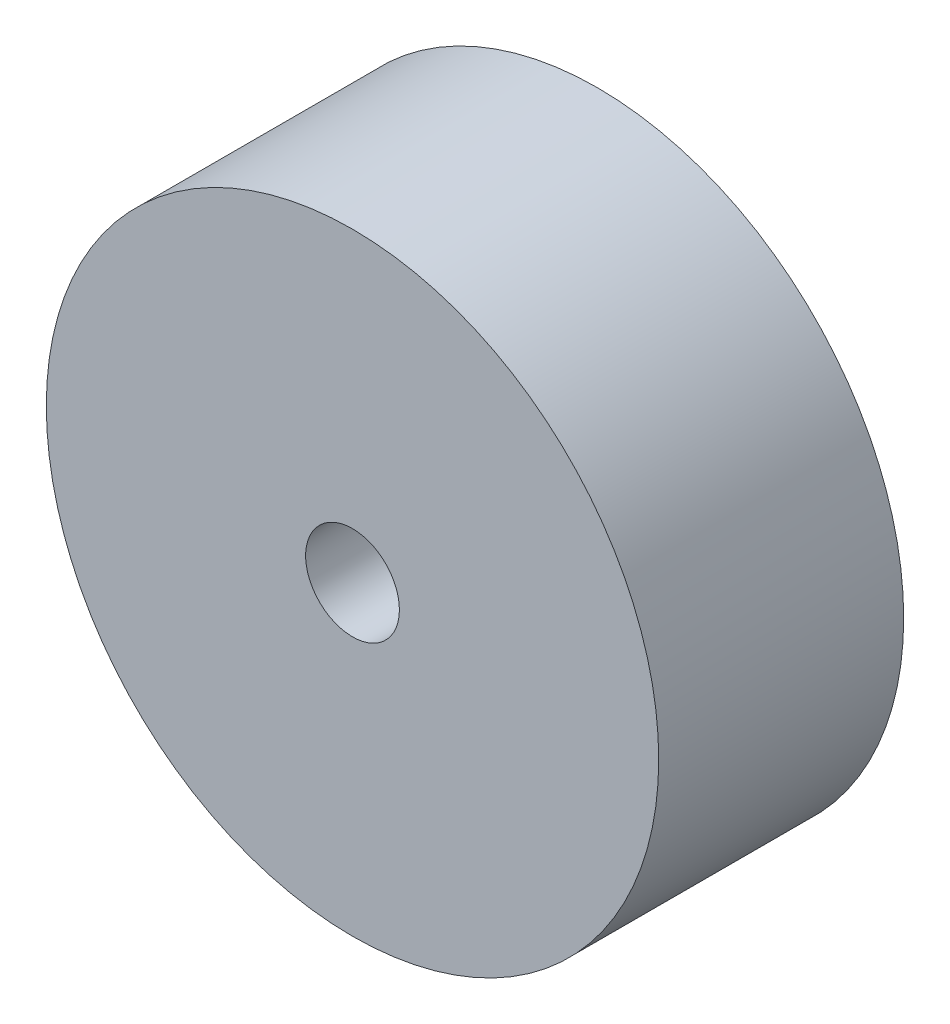
ISO-10303-21;
HEADER;
FILE_DESCRIPTION(('STEP AP214'),'2;1');
FILE_NAME('part.step','',(''),(''),'','','');
FILE_SCHEMA(('AUTOMOTIVE_DESIGN { 1 0 10303 214 1 1 1 1 }'));
ENDSEC;
DATA;
#1=APPLICATION_CONTEXT('core data for automotive mechanical design processes');
#2=APPLICATION_PROTOCOL_DEFINITION('international standard','automotive_design',2000,#1);
#3=PRODUCT_CONTEXT('',#1,'mechanical');
#4=PRODUCT('Part','Part','',(#3));
#5=PRODUCT_RELATED_PRODUCT_CATEGORY('part','',(#4));
#6=PRODUCT_DEFINITION_FORMATION('','',#4);
#7=PRODUCT_DEFINITION_CONTEXT('part definition',#1,'design');
#8=PRODUCT_DEFINITION('design','',#6,#7);
#9=PRODUCT_DEFINITION_SHAPE('','',#8);
#10=(LENGTH_UNIT() NAMED_UNIT(*) SI_UNIT(.MILLI.,.METRE.));
#11=(NAMED_UNIT(*) PLANE_ANGLE_UNIT() SI_UNIT($,.RADIAN.));
#12=(NAMED_UNIT(*) SI_UNIT($,.STERADIAN.) SOLID_ANGLE_UNIT());
#13=UNCERTAINTY_MEASURE_WITH_UNIT(LENGTH_MEASURE(1.E-05),#10,'distance_accuracy_value','');
#14=(GEOMETRIC_REPRESENTATION_CONTEXT(3) GLOBAL_UNCERTAINTY_ASSIGNED_CONTEXT((#13)) GLOBAL_UNIT_ASSIGNED_CONTEXT((#10,
#11,#12)) REPRESENTATION_CONTEXT('',''));
#15=CARTESIAN_POINT('',(0.,0.,0.));
#16=DIRECTION('',(0.,0.,1.));
#17=DIRECTION('',(1.,0.,0.));
#18=AXIS2_PLACEMENT_3D('',#15,#16,#17);
#19=CARTESIAN_POINT('',(-29.0822504710818,-1.70382614903984,5.8));
#20=DIRECTION('',(0.,0.,-1.));
#21=DIRECTION('',(-1.,0.,0.));
#22=AXIS2_PLACEMENT_3D('',#19,#20,#21);
#23=CYLINDRICAL_SURFACE('',#22,0.85);
#24=CARTESIAN_POINT('',(-29.0822504710818,-1.70382614903984,0.));
#25=DIRECTION('',(0.,0.,-1.));
#26=DIRECTION('',(-1.,0.,0.));
#27=AXIS2_PLACEMENT_3D('',#24,#25,#26);
#28=CIRCLE('',#27,0.85);
#29=CARTESIAN_POINT('',(-29.9322504710818,-1.70382614903984,0.));
#30=VERTEX_POINT('',#29);
#31=EDGE_CURVE('E71',#30,#30,#28,.T.);
#32=ORIENTED_EDGE('',*,*,#31,.T.);
#33=EDGE_LOOP('',(#32));
#34=FACE_BOUND('',#33,.T.);
#35=CARTESIAN_POINT('',(-29.0822504710818,-1.70382614903984,2.8));
#36=DIRECTION('',(0.,0.,1.));
#37=DIRECTION('',(1.,0.,0.));
#38=AXIS2_PLACEMENT_3D('',#35,#36,#37);
#39=CIRCLE('',#38,0.85);
#40=CARTESIAN_POINT('',(-28.2322504710818,-1.70382614903984,2.8));
#41=VERTEX_POINT('',#40);
#42=EDGE_CURVE('E43',#41,#41,#39,.F.);
#43=ORIENTED_EDGE('',*,*,#42,.F.);
#44=EDGE_LOOP('',(#43));
#45=FACE_BOUND('',#44,.T.);
#46=ADVANCED_FACE('F39',(#34,#45),#23,.F.);
#47=CARTESIAN_POINT('',(-29.0822504710818,-1.70382614903984,5.8));
#48=DIRECTION('',(0.,0.,-1.));
#49=DIRECTION('',(-1.,0.,0.));
#50=AXIS2_PLACEMENT_3D('',#47,#48,#49);
#51=CYLINDRICAL_SURFACE('',#50,7.25);
#52=CARTESIAN_POINT('',(-29.0822504710818,-1.70382614903984,5.8));
#53=DIRECTION('',(0.,0.,1.));
#54=DIRECTION('',(1.,0.,0.));
#55=AXIS2_PLACEMENT_3D('',#52,#53,#54);
#56=CIRCLE('',#55,7.25);
#57=CARTESIAN_POINT('',(-21.8322504710818,-1.70382614903984,5.8));
#58=VERTEX_POINT('',#57);
#59=EDGE_CURVE('E48',#58,#58,#56,.T.);
#60=ORIENTED_EDGE('',*,*,#59,.F.);
#61=EDGE_LOOP('',(#60));
#62=FACE_BOUND('',#61,.T.);
#63=CARTESIAN_POINT('',(-29.0822504710818,-1.70382614903984,0.));
#64=DIRECTION('',(0.,0.,1.));
#65=DIRECTION('',(1.,0.,0.));
#66=AXIS2_PLACEMENT_3D('',#63,#64,#65);
#67=CIRCLE('',#66,7.25);
#68=CARTESIAN_POINT('',(-21.8322504710818,-1.70382614903984,0.));
#69=VERTEX_POINT('',#68);
#70=EDGE_CURVE('E53',#69,#69,#67,.T.);
#71=ORIENTED_EDGE('',*,*,#70,.T.);
#72=EDGE_LOOP('',(#71));
#73=FACE_BOUND('',#72,.T.);
#74=ADVANCED_FACE('F41',(#62,#73),#51,.T.);
#75=CARTESIAN_POINT('',(-29.0822504710818,-1.70382614903984,5.8));
#76=DIRECTION('',(0.,0.,1.));
#77=DIRECTION('',(1.,0.,0.));
#78=AXIS2_PLACEMENT_3D('',#75,#76,#77);
#79=PLANE('',#78);
#80=CARTESIAN_POINT('',(-29.0822504710818,-1.70382614903984,5.8));
#81=DIRECTION('',(0.,0.,1.));
#82=DIRECTION('',(1.,0.,0.));
#83=AXIS2_PLACEMENT_3D('',#80,#81,#82);
#84=CIRCLE('',#83,1.11);
#85=CARTESIAN_POINT('',(-27.9722504710818,-1.70382614903984,5.8));
#86=VERTEX_POINT('',#85);
#87=EDGE_CURVE('E75',#86,#86,#84,.T.);
#88=ORIENTED_EDGE('',*,*,#87,.F.);
#89=EDGE_LOOP('',(#88));
#90=FACE_BOUND('',#89,.T.);
#91=ORIENTED_EDGE('',*,*,#59,.T.);
#92=EDGE_LOOP('',(#91));
#93=FACE_BOUND('',#92,.T.);
#94=ADVANCED_FACE('F96',(#90,#93),#79,.T.);
#95=CARTESIAN_POINT('',(-29.0822504710818,-1.70382614903984,0.));
#96=DIRECTION('',(0.,0.,1.));
#97=DIRECTION('',(1.,0.,0.));
#98=AXIS2_PLACEMENT_3D('',#95,#96,#97);
#99=PLANE('',#98);
#100=CARTESIAN_POINT('',(-29.0822504710818,-1.70382614903984,0.));
#101=DIRECTION('',(0.,0.,-1.));
#102=DIRECTION('',(-1.,0.,0.));
#103=AXIS2_PLACEMENT_3D('',#100,#101,#102);
#104=CIRCLE('',#103,6.325);
#105=CARTESIAN_POINT('',(-35.4072504710818,-1.70382614903984,0.));
#106=VERTEX_POINT('',#105);
#107=EDGE_CURVE('E60',#106,#106,#104,.T.);
#108=ORIENTED_EDGE('',*,*,#107,.F.);
#109=EDGE_LOOP('',(#108));
#110=FACE_BOUND('',#109,.T.);
#111=ORIENTED_EDGE('',*,*,#70,.F.);
#112=EDGE_LOOP('',(#111));
#113=FACE_BOUND('',#112,.T.);
#114=ADVANCED_FACE('F116',(#110,#113),#99,.F.);
#115=CARTESIAN_POINT('',(-29.0822504710818,-1.70382614903984,1.5875));
#116=DIRECTION('',(0.,0.,-1.));
#117=DIRECTION('',(-1.,0.,0.));
#118=AXIS2_PLACEMENT_3D('',#115,#116,#117);
#119=CYLINDRICAL_SURFACE('',#118,6.325);
#120=CARTESIAN_POINT('',(-29.0822504710818,-1.70382614903984,1.5875));
#121=DIRECTION('',(0.,0.,-1.));
#122=DIRECTION('',(-1.,0.,0.));
#123=AXIS2_PLACEMENT_3D('',#120,#121,#122);
#124=CIRCLE('',#123,6.325);
#125=CARTESIAN_POINT('',(-35.4072504710818,-1.70382614903984,1.5875));
#126=VERTEX_POINT('',#125);
#127=EDGE_CURVE('E58',#126,#126,#124,.T.);
#128=ORIENTED_EDGE('',*,*,#127,.F.);
#129=EDGE_LOOP('',(#128));
#130=FACE_BOUND('',#129,.T.);
#131=ORIENTED_EDGE('',*,*,#107,.T.);
#132=EDGE_LOOP('',(#131));
#133=FACE_BOUND('',#132,.T.);
#134=ADVANCED_FACE('F112',(#130,#133),#119,.F.);
#135=CARTESIAN_POINT('',(-29.0822504710818,-1.70382614903984,1.5875));
#136=DIRECTION('',(0.,0.,-1.));
#137=DIRECTION('',(-1.,0.,0.));
#138=AXIS2_PLACEMENT_3D('',#135,#136,#137);
#139=PLANE('',#138);
#140=CARTESIAN_POINT('',(-29.0822504710818,-1.70382614903984,1.5875));
#141=DIRECTION('',(0.,0.,-1.));
#142=DIRECTION('',(-1.,0.,0.));
#143=AXIS2_PLACEMENT_3D('',#140,#141,#142);
#144=CIRCLE('',#143,3.15);
#145=CARTESIAN_POINT('',(-32.2322504710818,-1.70382614903984,1.5875));
#146=VERTEX_POINT('',#145);
#147=EDGE_CURVE('E10',#146,#146,#144,.T.);
#148=ORIENTED_EDGE('',*,*,#147,.F.);
#149=EDGE_LOOP('',(#148));
#150=FACE_BOUND('',#149,.T.);
#151=ORIENTED_EDGE('',*,*,#127,.T.);
#152=EDGE_LOOP('',(#151));
#153=FACE_BOUND('',#152,.T.);
#154=ADVANCED_FACE('F106',(#150,#153),#139,.T.);
#155=CARTESIAN_POINT('',(-29.0822504710818,-1.70382614903984,3.));
#156=DIRECTION('',(0.,0.,-1.));
#157=DIRECTION('',(-1.,0.,0.));
#158=AXIS2_PLACEMENT_3D('',#155,#156,#157);
#159=CYLINDRICAL_SURFACE('',#158,3.15);
#160=ORIENTED_EDGE('',*,*,#147,.T.);
#161=EDGE_LOOP('',(#160));
#162=FACE_BOUND('',#161,.T.);
#163=CARTESIAN_POINT('',(-29.0822504710818,-1.70382614903984,0.));
#164=DIRECTION('',(0.,0.,-1.));
#165=DIRECTION('',(-1.,0.,0.));
#166=AXIS2_PLACEMENT_3D('',#163,#164,#165);
#167=CIRCLE('',#166,3.15);
#168=CARTESIAN_POINT('',(-32.2322504710818,-1.70382614903984,0.));
#169=VERTEX_POINT('',#168);
#170=EDGE_CURVE('E64',#169,#169,#167,.T.);
#171=ORIENTED_EDGE('',*,*,#170,.F.);
#172=EDGE_LOOP('',(#171));
#173=FACE_BOUND('',#172,.T.);
#174=ADVANCED_FACE('F102',(#162,#173),#159,.T.);
#175=CARTESIAN_POINT('',(-29.0822504710818,-1.70382614903984,0.));
#176=DIRECTION('',(0.,0.,-1.));
#177=DIRECTION('',(-1.,0.,0.));
#178=AXIS2_PLACEMENT_3D('',#175,#176,#177);
#179=PLANE('',#178);
#180=ORIENTED_EDGE('',*,*,#31,.F.);
#181=EDGE_LOOP('',(#180));
#182=FACE_BOUND('',#181,.T.);
#183=ORIENTED_EDGE('',*,*,#170,.T.);
#184=EDGE_LOOP('',(#183));
#185=FACE_BOUND('',#184,.T.);
#186=ADVANCED_FACE('F105',(#182,#185),#179,.T.);
#187=CARTESIAN_POINT('',(-29.0822504710818,-1.70382614903984,2.8));
#188=DIRECTION('',(0.,0.,1.));
#189=DIRECTION('',(1.,0.,0.));
#190=AXIS2_PLACEMENT_3D('',#187,#188,#189);
#191=PLANE('',#190);
#192=CARTESIAN_POINT('',(-29.0822504710818,-1.70382614903984,2.8));
#193=DIRECTION('',(0.,0.,1.));
#194=DIRECTION('',(1.,0.,0.));
#195=AXIS2_PLACEMENT_3D('',#192,#193,#194);
#196=CIRCLE('',#195,1.11);
#197=CARTESIAN_POINT('',(-27.9722504710818,-1.70382614903984,2.8));
#198=VERTEX_POINT('',#197);
#199=EDGE_CURVE('E79',#198,#198,#196,.T.);
#200=ORIENTED_EDGE('',*,*,#199,.T.);
#201=EDGE_LOOP('',(#200));
#202=FACE_BOUND('',#201,.T.);
#203=ORIENTED_EDGE('',*,*,#42,.T.);
#204=EDGE_LOOP('',(#203));
#205=FACE_BOUND('',#204,.T.);
#206=ADVANCED_FACE('F88',(#202,#205),#191,.T.);
#207=CARTESIAN_POINT('',(-29.0822504710818,-1.70382614903984,2.8));
#208=DIRECTION('',(0.,0.,1.));
#209=DIRECTION('',(1.,0.,0.));
#210=AXIS2_PLACEMENT_3D('',#207,#208,#209);
#211=CYLINDRICAL_SURFACE('',#210,1.11);
#212=ORIENTED_EDGE('',*,*,#199,.F.);
#213=EDGE_LOOP('',(#212));
#214=FACE_BOUND('',#213,.T.);
#215=ORIENTED_EDGE('',*,*,#87,.T.);
#216=EDGE_LOOP('',(#215));
#217=FACE_BOUND('',#216,.T.);
#218=ADVANCED_FACE('F100',(#214,#217),#211,.F.);
#219=CLOSED_SHELL('',(#46,#74,#94,#114,#134,#154,#174,#186,#206,#218));
#220=MANIFOLD_SOLID_BREP('B2',#219);
#221=ADVANCED_BREP_SHAPE_REPRESENTATION('',(#18,#220),#14);
#222=SHAPE_DEFINITION_REPRESENTATION(#9,#221);
ENDSEC;
END-ISO-10303-21;
